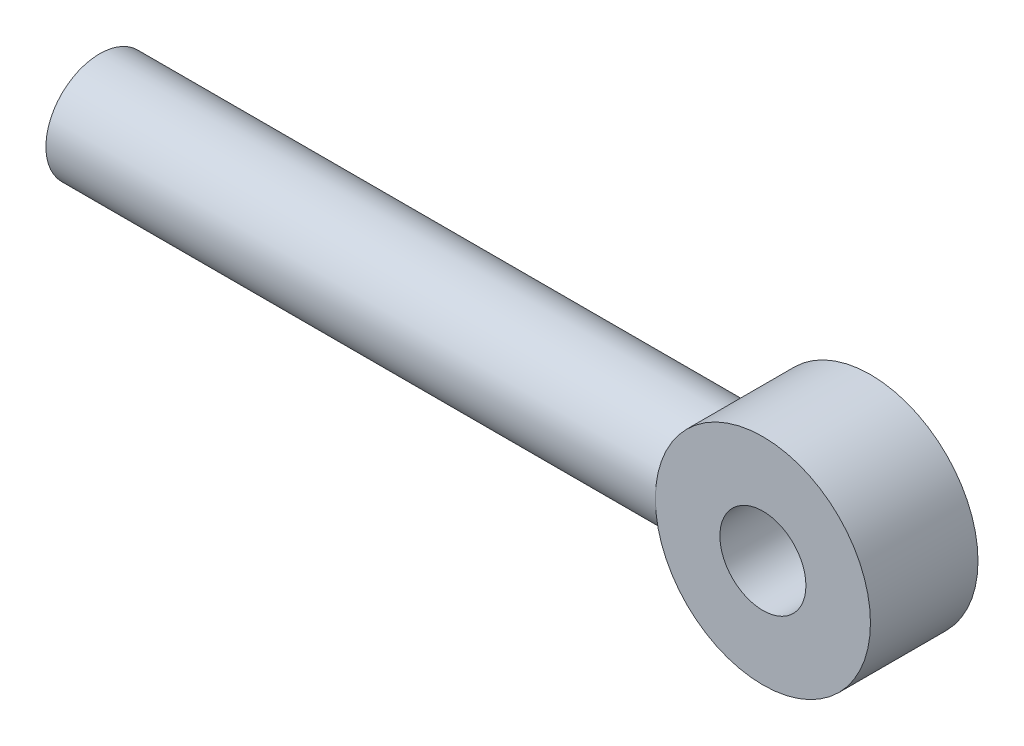
ISO-10303-21;
HEADER;
FILE_DESCRIPTION(('STEP AP214'),'2;1');
FILE_NAME('part.step','',(''),(''),'','','');
FILE_SCHEMA(('AUTOMOTIVE_DESIGN { 1 0 10303 214 1 1 1 1 }'));
ENDSEC;
DATA;
#1=APPLICATION_CONTEXT('core data for automotive mechanical design processes');
#2=APPLICATION_PROTOCOL_DEFINITION('international standard','automotive_design',2000,#1);
#3=PRODUCT_CONTEXT('',#1,'mechanical');
#4=PRODUCT('Part','Part','',(#3));
#5=PRODUCT_RELATED_PRODUCT_CATEGORY('part','',(#4));
#6=PRODUCT_DEFINITION_FORMATION('','',#4);
#7=PRODUCT_DEFINITION_CONTEXT('part definition',#1,'design');
#8=PRODUCT_DEFINITION('design','',#6,#7);
#9=PRODUCT_DEFINITION_SHAPE('','',#8);
#10=(LENGTH_UNIT() NAMED_UNIT(*) SI_UNIT(.MILLI.,.METRE.));
#11=(NAMED_UNIT(*) PLANE_ANGLE_UNIT() SI_UNIT($,.RADIAN.));
#12=(NAMED_UNIT(*) SI_UNIT($,.STERADIAN.) SOLID_ANGLE_UNIT());
#13=UNCERTAINTY_MEASURE_WITH_UNIT(LENGTH_MEASURE(1.E-05),#10,'distance_accuracy_value','');
#14=(GEOMETRIC_REPRESENTATION_CONTEXT(3) GLOBAL_UNCERTAINTY_ASSIGNED_CONTEXT((#13)) GLOBAL_UNIT_ASSIGNED_CONTEXT((#10,
#11,#12)) REPRESENTATION_CONTEXT('',''));
#15=CARTESIAN_POINT('',(0.,0.,0.));
#16=DIRECTION('',(0.,0.,1.));
#17=DIRECTION('',(1.,0.,0.));
#18=AXIS2_PLACEMENT_3D('',#15,#16,#17);
#19=CARTESIAN_POINT('',(10.,0.,-0.75));
#20=DIRECTION('',(0.,0.,1.));
#21=DIRECTION('',(1.,0.,0.));
#22=AXIS2_PLACEMENT_3D('',#19,#20,#21);
#23=CYLINDRICAL_SURFACE('',#22,1.5);
#24=CARTESIAN_POINT('',(8.5,0.,0.75));
#25=CARTESIAN_POINT('',(8.50000214946887,0.0394289722147398,0.749997523260375));
#26=CARTESIAN_POINT('',(8.50157131735362,0.0789049497735243,0.746872445158744));
#27=CARTESIAN_POINT('',(8.50769382971953,0.156690176451319,0.734510339744312));
#28=CARTESIAN_POINT('',(8.51225284128262,0.194997065035128,0.725261705251763));
#29=CARTESIAN_POINT('',(8.52387790447516,0.269200158660431,0.701104643537404));
#30=CARTESIAN_POINT('',(8.5309342061686,0.305105102204385,0.686218211813991));
#31=CARTESIAN_POINT('',(8.54690667613166,0.373854462604924,0.651322033976295));
#32=CARTESIAN_POINT('',(8.55582269774853,0.406699120492538,0.631312691813361));
#33=CARTESIAN_POINT('',(8.57532806306457,0.47063086332144,0.585362062886026));
#34=CARTESIAN_POINT('',(8.58598600654348,0.501491408341584,0.559135140570268));
#35=CARTESIAN_POINT('',(8.60755022314942,0.558584583650233,0.502108890564725));
#36=CARTESIAN_POINT('',(8.61845667843224,0.584813687330075,0.47130611117067));
#37=CARTESIAN_POINT('',(8.6402578660199,0.633939000337709,0.403137487857463));
#38=CARTESIAN_POINT('',(8.65108609772401,0.656419001663728,0.365447926240565));
#39=CARTESIAN_POINT('',(8.6703551592076,0.694626170168022,0.286224498010339));
#40=CARTESIAN_POINT('',(8.67879769294758,0.71035816122475,0.244693403457938));
#41=CARTESIAN_POINT('',(8.69156599721644,0.733599331641441,0.161501170933558));
#42=CARTESIAN_POINT('',(8.69610796312215,0.741544392810331,0.119996660949454));
#43=CARTESIAN_POINT('',(8.70113582538604,0.750320244981635,0.0360158716653923));
#44=CARTESIAN_POINT('',(8.70162572992534,0.751158066279806,-0.00645940565336632));
#45=CARTESIAN_POINT('',(8.69866802307064,0.746015465379221,-0.0857145182365266));
#46=CARTESIAN_POINT('',(8.6956842725349,0.740838419652616,-0.122568023417288));
#47=CARTESIAN_POINT('',(8.68692828449612,0.725204886792699,-0.194791432029782));
#48=CARTESIAN_POINT('',(8.68115515876168,0.714746717923239,-0.230160858978987));
#49=CARTESIAN_POINT('',(8.66734392690444,0.688657335289503,-0.299421849424245));
#50=CARTESIAN_POINT('',(8.65925619502001,0.672911300336996,-0.333259799089342));
#51=CARTESIAN_POINT('',(8.64172446788947,0.636781265751002,-0.397975719442506));
#52=CARTESIAN_POINT('',(8.63227986414857,0.616395182859351,-0.428852351700067));
#53=CARTESIAN_POINT('',(8.61165131572536,0.568549541184591,-0.49089093955742));
#54=CARTESIAN_POINT('',(8.60039867322441,0.540520843776961,-0.521592655182118));
#55=CARTESIAN_POINT('',(8.57839282524695,0.47966668405603,-0.578051563943176));
#56=CARTESIAN_POINT('',(8.567639860309,0.446838942430714,-0.603806394025412));
#57=CARTESIAN_POINT('',(8.54723509537777,0.375387379373886,-0.650764245772296));
#58=CARTESIAN_POINT('',(8.53765761878495,0.336565193699556,-0.671700354334305));
#59=CARTESIAN_POINT('',(8.52131589159069,0.255349661616598,-0.706572771782257));
#60=CARTESIAN_POINT('',(8.51454940792336,0.212959182198957,-0.720514638761375));
#61=CARTESIAN_POINT('',(8.50506749693923,0.129574868745526,-0.739856552787507));
#62=CARTESIAN_POINT('',(8.50206296274016,0.0887561479112432,-0.745868426810084));
#63=CARTESIAN_POINT('',(8.49945239905674,0.0065846999620152,-0.751098548350868));
#64=CARTESIAN_POINT('',(8.49984475959016,-0.0347677649024261,-0.750320014229609));
#65=CARTESIAN_POINT('',(8.5038160580992,-0.113424728989495,-0.742344983685935));
#66=CARTESIAN_POINT('',(8.50714565733858,-0.150794556037466,-0.735650600452477));
#67=CARTESIAN_POINT('',(8.51633371513886,-0.223805169226438,-0.716821446078686));
#68=CARTESIAN_POINT('',(8.52219245249251,-0.259445764268248,-0.704686075159981));
#69=CARTESIAN_POINT('',(8.53611811439748,-0.329166456337249,-0.675001150175121));
#70=CARTESIAN_POINT('',(8.54424338672546,-0.363172797754615,-0.65730671241239));
#71=CARTESIAN_POINT('',(8.56192019262168,-0.427846021274191,-0.617169348265469));
#72=CARTESIAN_POINT('',(8.57147233325661,-0.458511472331462,-0.594724399054926));
#73=CARTESIAN_POINT('',(8.59218833996902,-0.51882576696799,-0.543179681000345));
#74=CARTESIAN_POINT('',(8.60341836363669,-0.548079058368479,-0.513642848659826));
#75=CARTESIAN_POINT('',(8.62553206297094,-0.60139224083493,-0.450056136548022));
#76=CARTESIAN_POINT('',(8.63641549463856,-0.625448539268131,-0.41600316088772));
#77=CARTESIAN_POINT('',(8.65711605830449,-0.668780935873272,-0.342267259349767));
#78=CARTESIAN_POINT('',(8.66685602752396,-0.687769121908978,-0.302391550343554));
#79=CARTESIAN_POINT('',(8.68319445723906,-0.718562119510352,-0.219367449230609));
#80=CARTESIAN_POINT('',(8.68979696319536,-0.730376186915678,-0.17622335512411));
#81=CARTESIAN_POINT('',(8.698288742435,-0.745396265587259,-0.0923173328539137));
#82=CARTESIAN_POINT('',(8.70056962404632,-0.749319747300649,-0.051724309928223));
#83=CARTESIAN_POINT('',(8.70125984015369,-0.750516865785591,0.0295853003780463));
#84=CARTESIAN_POINT('',(8.69967085279336,-0.747793384968299,0.0703018265545751));
#85=CARTESIAN_POINT('',(8.69321603462481,-0.736444594194197,0.146612626149012));
#86=CARTESIAN_POINT('',(8.68867679138205,-0.7284062357571,0.1823253526083));
#87=CARTESIAN_POINT('',(8.67721737859062,-0.707381518668484,0.25185608956853));
#88=CARTESIAN_POINT('',(8.67029644322744,-0.694393568369858,0.285673486568976));
#89=CARTESIAN_POINT('',(8.65428602226604,-0.662861808975512,0.352968638239955));
#90=CARTESIAN_POINT('',(8.64508208202857,-0.644003353362343,0.386270926372276));
#91=CARTESIAN_POINT('',(8.62573501274058,-0.601613228727475,0.44945590213544));
#92=CARTESIAN_POINT('',(8.61559139654108,-0.578079128428986,0.479336797888868));
#93=CARTESIAN_POINT('',(8.59403257630516,-0.523652494998481,0.538606486768212));
#94=CARTESIAN_POINT('',(8.58261262516399,-0.492213317257628,0.567494326771442));
#95=CARTESIAN_POINT('',(8.56091685808684,-0.424616104665209,0.619697237567725));
#96=CARTESIAN_POINT('',(8.5506416604397,-0.388455542442589,0.643009304569717));
#97=CARTESIAN_POINT('',(8.53226492811173,-0.31194869761496,0.683427272071653));
#98=CARTESIAN_POINT('',(8.52417927577818,-0.271574627950961,0.700488127058576));
#99=CARTESIAN_POINT('',(8.51123993977401,-0.188056575970643,0.727356125939214));
#100=CARTESIAN_POINT('',(8.50637707470301,-0.144920849717374,0.737183885122183));
#101=CARTESIAN_POINT('',(8.50228403567753,-0.0844514598625376,0.745423058306887));
#102=CARTESIAN_POINT('',(8.50142975995599,-0.0676214095796236,0.747136980647715));
#103=CARTESIAN_POINT('',(8.50028727266601,-0.0338637988553679,0.749425999137605));
#104=CARTESIAN_POINT('',(8.49999907672178,-0.0169362357355359,0.7500010638534));
#105=CARTESIAN_POINT('',(8.5,0.,0.75));
#106=B_SPLINE_CURVE_WITH_KNOTS('',3,(#24,#25,#26,#27,#28,#29,#30,#31,#32,#33,#34,#35,#36,#37,
#38,#39,#40,#41,#42,#43,#44,#45,#46,#47,#48,#49,#50,#51,#52,#53,#54,#55,#56,#57,#58,#59,#60,#61,
#62,#63,#64,#65,#66,#67,#68,#69,#70,#71,#72,#73,#74,#75,#76,#77,#78,#79,#80,#81,#82,#83,#84,#85,
#86,#87,#88,#89,#90,#91,#92,#93,#94,#95,#96,#97,#98,#99,#100,#101,#102,#103,#104,#105),
.UNSPECIFIED.,.T.,.F.,(4,2,2,2,2,2,2,2,2,2,2,2,2,2,2,2,2,2,2,2,2,2,2,2,2,2,2,2,2,2,2,2,2,2,2,2,
2,2,2,2,4),(0.,0.118218193065219,0.236661112281898,0.354646616619224,0.472622820436176,
0.597736319038567,0.722944678240527,0.857862948230645,0.992684609237107,1.11943509105172,
1.24606017996765,1.3575428430699,1.46906102944259,1.58317680126366,1.69734390945166,
1.82598706000409,1.95469150949015,2.08937266660831,2.2239466268421,2.34737467853509,
2.47074423383607,2.58455179879592,2.69837191223199,2.81544642020924,2.93257088061255,
3.06119707983314,3.18991191461574,3.32486011619756,3.45963383955583,3.5814698062378,
3.70325294895004,3.81343447683137,3.92365146587759,4.04127342581711,4.15895670854218,
4.29093932064374,4.4229928753243,4.55598010247194,4.68858681468698,4.73936460103273,
4.79014378886135),.UNSPECIFIED.);
#107=CARTESIAN_POINT('',(8.5,0.,0.75));
#108=VERTEX_POINT('',#107);
#109=CARTESIAN_POINT('',(8.5,0.,-0.75));
#110=VERTEX_POINT('',#109);
#111=EDGE_CURVE('E11',#108,#110,#106,.T.);
#112=ORIENTED_EDGE('',*,*,#111,.F.);
#113=CARTESIAN_POINT('',(10.,0.,0.75));
#114=DIRECTION('',(0.,0.,1.));
#115=DIRECTION('',(1.,0.,0.));
#116=AXIS2_PLACEMENT_3D('',#113,#114,#115);
#117=CIRCLE('',#116,1.5);
#118=EDGE_CURVE('E60',#108,#108,#117,.T.);
#119=ORIENTED_EDGE('',*,*,#118,.F.);
#120=EDGE_CURVE('E44',#110,#108,#106,.T.);
#121=ORIENTED_EDGE('',*,*,#120,.F.);
#122=CARTESIAN_POINT('',(10.,0.,-0.75));
#123=DIRECTION('',(0.,0.,1.));
#124=DIRECTION('',(1.,0.,0.));
#125=AXIS2_PLACEMENT_3D('',#122,#123,#124);
#126=CIRCLE('',#125,1.5);
#127=EDGE_CURVE('E64',#110,#110,#126,.T.);
#128=ORIENTED_EDGE('',*,*,#127,.T.);
#129=EDGE_LOOP('',(#112,#119,#121,#128));
#130=FACE_BOUND('',#129,.T.);
#131=ADVANCED_FACE('F39',(#130),#23,.T.);
#132=CARTESIAN_POINT('',(10.,0.,-0.75));
#133=DIRECTION('',(0.,0.,1.));
#134=DIRECTION('',(1.,0.,0.));
#135=AXIS2_PLACEMENT_3D('',#132,#133,#134);
#136=PLANE('',#135);
#137=CARTESIAN_POINT('',(10.,0.,-0.75));
#138=DIRECTION('',(0.,0.,1.));
#139=DIRECTION('',(1.,0.,0.));
#140=AXIS2_PLACEMENT_3D('',#137,#138,#139);
#141=CIRCLE('',#140,0.6);
#142=CARTESIAN_POINT('',(10.6,0.,-0.75));
#143=VERTEX_POINT('',#142);
#144=EDGE_CURVE('E77',#143,#143,#141,.T.);
#145=ORIENTED_EDGE('',*,*,#144,.T.);
#146=EDGE_LOOP('',(#145));
#147=FACE_BOUND('',#146,.T.);
#148=ORIENTED_EDGE('',*,*,#127,.F.);
#149=EDGE_LOOP('',(#148));
#150=FACE_BOUND('',#149,.T.);
#151=ADVANCED_FACE('F86',(#147,#150),#136,.F.);
#152=CARTESIAN_POINT('',(10.,0.,0.75));
#153=DIRECTION('',(0.,0.,1.));
#154=DIRECTION('',(1.,0.,0.));
#155=AXIS2_PLACEMENT_3D('',#152,#153,#154);
#156=PLANE('',#155);
#157=CARTESIAN_POINT('',(10.,0.,0.75));
#158=DIRECTION('',(0.,0.,1.));
#159=DIRECTION('',(1.,0.,0.));
#160=AXIS2_PLACEMENT_3D('',#157,#158,#159);
#161=CIRCLE('',#160,0.6);
#162=CARTESIAN_POINT('',(10.6,0.,0.75));
#163=VERTEX_POINT('',#162);
#164=EDGE_CURVE('E78',#163,#163,#161,.T.);
#165=ORIENTED_EDGE('',*,*,#164,.F.);
#166=EDGE_LOOP('',(#165));
#167=FACE_BOUND('',#166,.T.);
#168=ORIENTED_EDGE('',*,*,#118,.T.);
#169=EDGE_LOOP('',(#168));
#170=FACE_BOUND('',#169,.T.);
#171=ADVANCED_FACE('F96',(#167,#170),#156,.T.);
#172=CARTESIAN_POINT('',(10.,0.,0.));
#173=DIRECTION('',(-1.,0.,0.));
#174=DIRECTION('',(0.,0.,1.));
#175=AXIS2_PLACEMENT_3D('',#172,#173,#174);
#176=CYLINDRICAL_SURFACE('',#175,0.75);
#177=ORIENTED_EDGE('',*,*,#120,.T.);
#178=ORIENTED_EDGE('',*,*,#111,.T.);
#179=EDGE_LOOP('',(#177,#178));
#180=FACE_BOUND('',#179,.T.);
#181=CARTESIAN_POINT('',(0.,0.,0.));
#182=DIRECTION('',(1.,0.,0.));
#183=DIRECTION('',(0.,0.,-1.));
#184=AXIS2_PLACEMENT_3D('',#181,#182,#183);
#185=CIRCLE('',#184,0.75);
#186=CARTESIAN_POINT('',(0.,0.,-0.75));
#187=VERTEX_POINT('',#186);
#188=EDGE_CURVE('E67',#187,#187,#185,.T.);
#189=ORIENTED_EDGE('',*,*,#188,.T.);
#190=EDGE_LOOP('',(#189));
#191=FACE_BOUND('',#190,.T.);
#192=ADVANCED_FACE('F41',(#180,#191),#176,.T.);
#193=CARTESIAN_POINT('',(0.,0.,0.));
#194=DIRECTION('',(1.,0.,0.));
#195=DIRECTION('',(0.,0.,-1.));
#196=AXIS2_PLACEMENT_3D('',#193,#194,#195);
#197=PLANE('',#196);
#198=ORIENTED_EDGE('',*,*,#188,.F.);
#199=EDGE_LOOP('',(#198));
#200=FACE_BOUND('',#199,.T.);
#201=ADVANCED_FACE('F92',(#200),#197,.F.);
#202=CARTESIAN_POINT('',(10.,0.,-0.75));
#203=DIRECTION('',(0.,0.,1.));
#204=DIRECTION('',(1.,0.,0.));
#205=AXIS2_PLACEMENT_3D('',#202,#203,#204);
#206=CYLINDRICAL_SURFACE('',#205,0.6);
#207=ORIENTED_EDGE('',*,*,#144,.F.);
#208=EDGE_LOOP('',(#207));
#209=FACE_BOUND('',#208,.T.);
#210=ORIENTED_EDGE('',*,*,#164,.T.);
#211=EDGE_LOOP('',(#210));
#212=FACE_BOUND('',#211,.T.);
#213=ADVANCED_FACE('F89',(#209,#212),#206,.F.);
#214=CLOSED_SHELL('',(#131,#151,#171,#192,#201,#213));
#215=MANIFOLD_SOLID_BREP('B2',#214);
#216=ADVANCED_BREP_SHAPE_REPRESENTATION('',(#18,#215),#14);
#217=SHAPE_DEFINITION_REPRESENTATION(#9,#216);
ENDSEC;
END-ISO-10303-21;
